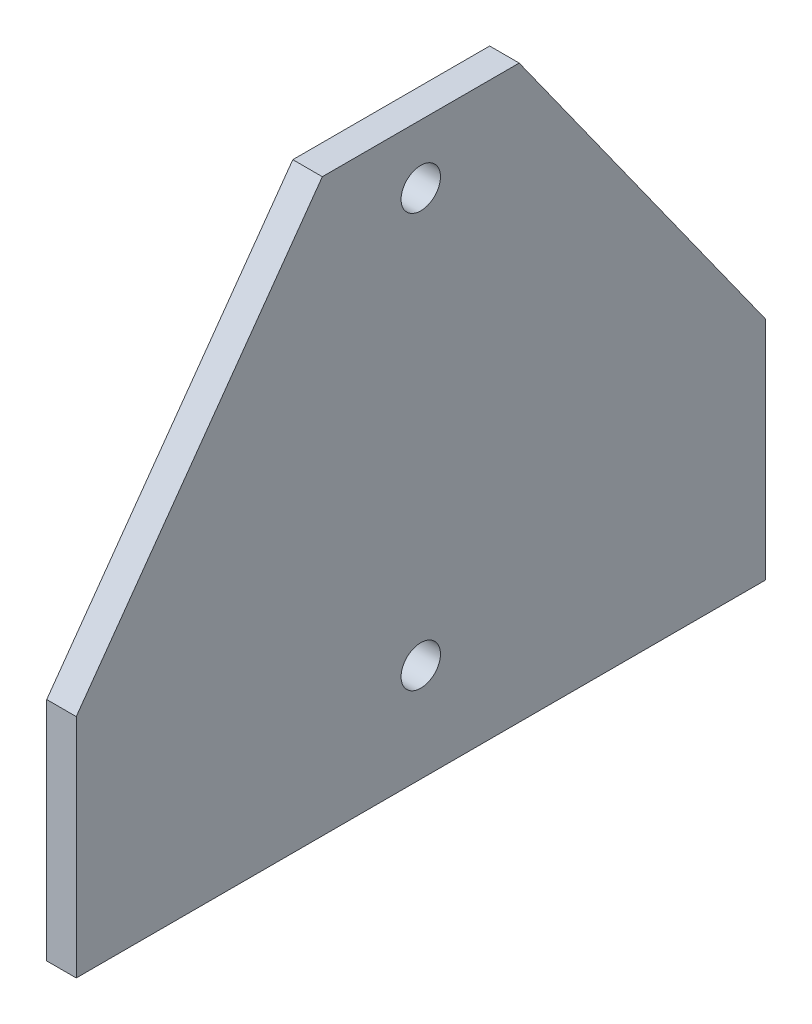
ISO-10303-21;
HEADER;
FILE_DESCRIPTION(('STEP AP214'),'2;1');
FILE_NAME('part.step','',(''),(''),'','','');
FILE_SCHEMA(('AUTOMOTIVE_DESIGN { 1 0 10303 214 1 1 1 1 }'));
ENDSEC;
DATA;
#1=APPLICATION_CONTEXT('core data for automotive mechanical design processes');
#2=APPLICATION_PROTOCOL_DEFINITION('international standard','automotive_design',2000,#1);
#3=PRODUCT_CONTEXT('',#1,'mechanical');
#4=PRODUCT('Part','Part','',(#3));
#5=PRODUCT_RELATED_PRODUCT_CATEGORY('part','',(#4));
#6=PRODUCT_DEFINITION_FORMATION('','',#4);
#7=PRODUCT_DEFINITION_CONTEXT('part definition',#1,'design');
#8=PRODUCT_DEFINITION('design','',#6,#7);
#9=PRODUCT_DEFINITION_SHAPE('','',#8);
#10=(LENGTH_UNIT() NAMED_UNIT(*) SI_UNIT(.MILLI.,.METRE.));
#11=(NAMED_UNIT(*) PLANE_ANGLE_UNIT() SI_UNIT($,.RADIAN.));
#12=(NAMED_UNIT(*) SI_UNIT($,.STERADIAN.) SOLID_ANGLE_UNIT());
#13=UNCERTAINTY_MEASURE_WITH_UNIT(LENGTH_MEASURE(1.E-05),#10,'distance_accuracy_value','');
#14=(GEOMETRIC_REPRESENTATION_CONTEXT(3) GLOBAL_UNCERTAINTY_ASSIGNED_CONTEXT((#13)) GLOBAL_UNIT_ASSIGNED_CONTEXT((#10,
#11,#12)) REPRESENTATION_CONTEXT('',''));
#15=CARTESIAN_POINT('',(0.,0.,0.));
#16=DIRECTION('',(0.,0.,1.));
#17=DIRECTION('',(1.,0.,0.));
#18=AXIS2_PLACEMENT_3D('',#15,#16,#17);
#19=CARTESIAN_POINT('',(3.,0.,0.));
#20=DIRECTION('',(1.,0.,0.));
#21=DIRECTION('',(0.,0.,-1.));
#22=AXIS2_PLACEMENT_3D('',#19,#20,#21);
#23=PLANE('',#22);
#24=CARTESIAN_POINT('',(3.,-13.,-35.));
#25=DIRECTION('',(1.,0.,0.));
#26=DIRECTION('',(0.,0.,-1.));
#27=AXIS2_PLACEMENT_3D('',#24,#25,#26);
#28=CIRCLE('',#27,2.);
#29=CARTESIAN_POINT('',(3.,-13.,-37.));
#30=VERTEX_POINT('',#29);
#31=EDGE_CURVE('E121',#30,#30,#28,.T.);
#32=ORIENTED_EDGE('',*,*,#31,.F.);
#33=EDGE_LOOP('',(#32));
#34=FACE_BOUND('',#33,.T.);
#35=DIRECTION('',(0.,-1.,0.));
#36=VECTOR('',#35,1.);
#37=CARTESIAN_POINT('',(3.,0.,0.));
#38=LINE('',#37,#36);
#39=CARTESIAN_POINT('',(3.,0.,0.));
#40=VERTEX_POINT('',#39);
#41=CARTESIAN_POINT('',(3.,-23.,0.));
#42=VERTEX_POINT('',#41);
#43=EDGE_CURVE('E128',#40,#42,#38,.T.);
#44=ORIENTED_EDGE('',*,*,#43,.T.);
#45=DIRECTION('',(0.,0.,-1.));
#46=VECTOR('',#45,1.);
#47=CARTESIAN_POINT('',(3.,-23.,0.));
#48=LINE('',#47,#46);
#49=CARTESIAN_POINT('',(3.,-23.,-70.));
#50=VERTEX_POINT('',#49);
#51=EDGE_CURVE('E86',#42,#50,#48,.T.);
#52=ORIENTED_EDGE('',*,*,#51,.T.);
#53=DIRECTION('',(0.,1.,0.));
#54=VECTOR('',#53,1.);
#55=CARTESIAN_POINT('',(3.,0.,-70.));
#56=LINE('',#55,#54);
#57=CARTESIAN_POINT('',(3.,0.,-70.));
#58=VERTEX_POINT('',#57);
#59=EDGE_CURVE('E99',#50,#58,#56,.T.);
#60=ORIENTED_EDGE('',*,*,#59,.T.);
#61=DIRECTION('',(0.,0.813733471206735,0.581238193719096));
#62=VECTOR('',#61,1.);
#63=CARTESIAN_POINT('',(3.,35.,-45.));
#64=LINE('',#63,#62);
#65=CARTESIAN_POINT('',(3.,35.,-45.));
#66=VERTEX_POINT('',#65);
#67=EDGE_CURVE('E93',#58,#66,#64,.T.);
#68=ORIENTED_EDGE('',*,*,#67,.T.);
#69=DIRECTION('',(0.,0.,1.));
#70=VECTOR('',#69,1.);
#71=CARTESIAN_POINT('',(3.,35.,-25.));
#72=LINE('',#71,#70);
#73=CARTESIAN_POINT('',(3.,35.,-25.));
#74=VERTEX_POINT('',#73);
#75=EDGE_CURVE('E97',#66,#74,#72,.T.);
#76=ORIENTED_EDGE('',*,*,#75,.T.);
#77=DIRECTION('',(0.,-0.813733471206735,0.581238193719096));
#78=VECTOR('',#77,1.);
#79=CARTESIAN_POINT('',(3.,0.,0.));
#80=LINE('',#79,#78);
#81=EDGE_CURVE('E49',#74,#40,#80,.T.);
#82=ORIENTED_EDGE('',*,*,#81,.T.);
#83=EDGE_LOOP('',(#44,#52,#60,#68,#76,#82));
#84=FACE_BOUND('',#83,.T.);
#85=CARTESIAN_POINT('',(3.,29.,-35.));
#86=DIRECTION('',(1.,0.,0.));
#87=DIRECTION('',(0.,0.,-1.));
#88=AXIS2_PLACEMENT_3D('',#85,#86,#87);
#89=CIRCLE('',#88,2.);
#90=CARTESIAN_POINT('',(3.,29.,-37.));
#91=VERTEX_POINT('',#90);
#92=EDGE_CURVE('E171',#91,#91,#89,.T.);
#93=ORIENTED_EDGE('',*,*,#92,.F.);
#94=EDGE_LOOP('',(#93));
#95=FACE_BOUND('',#94,.T.);
#96=ADVANCED_FACE('F32',(#34,#84,#95),#23,.T.);
#97=CARTESIAN_POINT('',(0.,0.,0.));
#98=DIRECTION('',(1.,0.,0.));
#99=DIRECTION('',(0.,0.,-1.));
#100=AXIS2_PLACEMENT_3D('',#97,#98,#99);
#101=PLANE('',#100);
#102=CARTESIAN_POINT('',(0.,-13.,-35.));
#103=DIRECTION('',(1.,0.,0.));
#104=DIRECTION('',(0.,0.,-1.));
#105=AXIS2_PLACEMENT_3D('',#102,#103,#104);
#106=CIRCLE('',#105,2.);
#107=CARTESIAN_POINT('',(0.,-13.,-37.));
#108=VERTEX_POINT('',#107);
#109=EDGE_CURVE('E176',#108,#108,#106,.T.);
#110=ORIENTED_EDGE('',*,*,#109,.T.);
#111=EDGE_LOOP('',(#110));
#112=FACE_BOUND('',#111,.T.);
#113=DIRECTION('',(0.,-1.,0.));
#114=VECTOR('',#113,1.);
#115=CARTESIAN_POINT('',(0.,0.,0.));
#116=LINE('',#115,#114);
#117=CARTESIAN_POINT('',(0.,0.,0.));
#118=VERTEX_POINT('',#117);
#119=CARTESIAN_POINT('',(0.,-23.,0.));
#120=VERTEX_POINT('',#119);
#121=EDGE_CURVE('E117',#118,#120,#116,.T.);
#122=ORIENTED_EDGE('',*,*,#121,.F.);
#123=DIRECTION('',(0.,-0.813733471206735,0.581238193719096));
#124=VECTOR('',#123,1.);
#125=CARTESIAN_POINT('',(0.,0.,0.));
#126=LINE('',#125,#124);
#127=CARTESIAN_POINT('',(0.,35.,-25.));
#128=VERTEX_POINT('',#127);
#129=EDGE_CURVE('E78',#128,#118,#126,.T.);
#130=ORIENTED_EDGE('',*,*,#129,.F.);
#131=DIRECTION('',(0.,0.,1.));
#132=VECTOR('',#131,1.);
#133=CARTESIAN_POINT('',(0.,35.,-25.));
#134=LINE('',#133,#132);
#135=CARTESIAN_POINT('',(0.,35.,-45.));
#136=VERTEX_POINT('',#135);
#137=EDGE_CURVE('E72',#136,#128,#134,.T.);
#138=ORIENTED_EDGE('',*,*,#137,.F.);
#139=DIRECTION('',(0.,0.813733471206735,0.581238193719096));
#140=VECTOR('',#139,1.);
#141=CARTESIAN_POINT('',(0.,35.,-45.));
#142=LINE('',#141,#140);
#143=CARTESIAN_POINT('',(0.,0.,-70.));
#144=VERTEX_POINT('',#143);
#145=EDGE_CURVE('E107',#144,#136,#142,.T.);
#146=ORIENTED_EDGE('',*,*,#145,.F.);
#147=DIRECTION('',(0.,1.,0.));
#148=VECTOR('',#147,1.);
#149=CARTESIAN_POINT('',(0.,0.,-70.));
#150=LINE('',#149,#148);
#151=CARTESIAN_POINT('',(0.,-23.,-70.));
#152=VERTEX_POINT('',#151);
#153=EDGE_CURVE('E123',#152,#144,#150,.T.);
#154=ORIENTED_EDGE('',*,*,#153,.F.);
#155=DIRECTION('',(0.,0.,-1.));
#156=VECTOR('',#155,1.);
#157=CARTESIAN_POINT('',(0.,-23.,0.));
#158=LINE('',#157,#156);
#159=EDGE_CURVE('E120',#120,#152,#158,.T.);
#160=ORIENTED_EDGE('',*,*,#159,.F.);
#161=EDGE_LOOP('',(#122,#130,#138,#146,#154,#160));
#162=FACE_BOUND('',#161,.T.);
#163=CARTESIAN_POINT('',(0.,29.,-35.));
#164=DIRECTION('',(1.,0.,0.));
#165=DIRECTION('',(0.,0.,-1.));
#166=AXIS2_PLACEMENT_3D('',#163,#164,#165);
#167=CIRCLE('',#166,2.);
#168=CARTESIAN_POINT('',(0.,29.,-37.));
#169=VERTEX_POINT('',#168);
#170=EDGE_CURVE('E174',#169,#169,#167,.T.);
#171=ORIENTED_EDGE('',*,*,#170,.T.);
#172=EDGE_LOOP('',(#171));
#173=FACE_BOUND('',#172,.T.);
#174=ADVANCED_FACE('F137',(#112,#162,#173),#101,.F.);
#175=CARTESIAN_POINT('',(3.,0.,0.));
#176=DIRECTION('',(0.,0.,-1.));
#177=DIRECTION('',(0.,1.,0.));
#178=AXIS2_PLACEMENT_3D('',#175,#176,#177);
#179=PLANE('',#178);
#180=ORIENTED_EDGE('',*,*,#121,.T.);
#181=DIRECTION('',(-1.,0.,0.));
#182=VECTOR('',#181,1.);
#183=CARTESIAN_POINT('',(3.,-23.,0.));
#184=LINE('',#183,#182);
#185=EDGE_CURVE('E11',#42,#120,#184,.T.);
#186=ORIENTED_EDGE('',*,*,#185,.F.);
#187=ORIENTED_EDGE('',*,*,#43,.F.);
#188=DIRECTION('',(-1.,0.,0.));
#189=VECTOR('',#188,1.);
#190=CARTESIAN_POINT('',(3.,0.,0.));
#191=LINE('',#190,#189);
#192=EDGE_CURVE('E113',#40,#118,#191,.T.);
#193=ORIENTED_EDGE('',*,*,#192,.T.);
#194=EDGE_LOOP('',(#180,#186,#187,#193));
#195=FACE_BOUND('',#194,.T.);
#196=ADVANCED_FACE('F34',(#195),#179,.F.);
#197=CARTESIAN_POINT('',(3.,-23.,0.));
#198=DIRECTION('',(0.,1.,0.));
#199=DIRECTION('',(0.,0.,1.));
#200=AXIS2_PLACEMENT_3D('',#197,#198,#199);
#201=PLANE('',#200);
#202=ORIENTED_EDGE('',*,*,#159,.T.);
#203=DIRECTION('',(-1.,0.,0.));
#204=VECTOR('',#203,1.);
#205=CARTESIAN_POINT('',(3.,-23.,-70.));
#206=LINE('',#205,#204);
#207=EDGE_CURVE('E41',#50,#152,#206,.T.);
#208=ORIENTED_EDGE('',*,*,#207,.F.);
#209=ORIENTED_EDGE('',*,*,#51,.F.);
#210=ORIENTED_EDGE('',*,*,#185,.T.);
#211=EDGE_LOOP('',(#202,#208,#209,#210));
#212=FACE_BOUND('',#211,.T.);
#213=ADVANCED_FACE('F217',(#212),#201,.F.);
#214=CARTESIAN_POINT('',(3.,0.,-70.));
#215=DIRECTION('',(0.,0.,1.));
#216=DIRECTION('',(0.,-1.,0.));
#217=AXIS2_PLACEMENT_3D('',#214,#215,#216);
#218=PLANE('',#217);
#219=ORIENTED_EDGE('',*,*,#153,.T.);
#220=DIRECTION('',(-1.,0.,0.));
#221=VECTOR('',#220,1.);
#222=CARTESIAN_POINT('',(3.,0.,-70.));
#223=LINE('',#222,#221);
#224=EDGE_CURVE('E108',#58,#144,#223,.T.);
#225=ORIENTED_EDGE('',*,*,#224,.F.);
#226=ORIENTED_EDGE('',*,*,#59,.F.);
#227=ORIENTED_EDGE('',*,*,#207,.T.);
#228=EDGE_LOOP('',(#219,#225,#226,#227));
#229=FACE_BOUND('',#228,.T.);
#230=ADVANCED_FACE('F134',(#229),#218,.F.);
#231=CARTESIAN_POINT('',(3.,35.,-45.));
#232=DIRECTION('',(0.,-0.581238193719096,0.813733471206735));
#233=DIRECTION('',(0.,-0.813733471206735,-0.581238193719096));
#234=AXIS2_PLACEMENT_3D('',#231,#232,#233);
#235=PLANE('',#234);
#236=ORIENTED_EDGE('',*,*,#145,.T.);
#237=DIRECTION('',(-1.,0.,0.));
#238=VECTOR('',#237,1.);
#239=CARTESIAN_POINT('',(3.,35.,-45.));
#240=LINE('',#239,#238);
#241=EDGE_CURVE('E104',#66,#136,#240,.T.);
#242=ORIENTED_EDGE('',*,*,#241,.F.);
#243=ORIENTED_EDGE('',*,*,#67,.F.);
#244=ORIENTED_EDGE('',*,*,#224,.T.);
#245=EDGE_LOOP('',(#236,#242,#243,#244));
#246=FACE_BOUND('',#245,.T.);
#247=ADVANCED_FACE('F105',(#246),#235,.F.);
#248=CARTESIAN_POINT('',(3.,35.,-25.));
#249=DIRECTION('',(0.,-1.,0.));
#250=DIRECTION('',(0.,0.,-1.));
#251=AXIS2_PLACEMENT_3D('',#248,#249,#250);
#252=PLANE('',#251);
#253=ORIENTED_EDGE('',*,*,#137,.T.);
#254=DIRECTION('',(-1.,0.,0.));
#255=VECTOR('',#254,1.);
#256=CARTESIAN_POINT('',(3.,35.,-25.));
#257=LINE('',#256,#255);
#258=EDGE_CURVE('E109',#74,#128,#257,.T.);
#259=ORIENTED_EDGE('',*,*,#258,.F.);
#260=ORIENTED_EDGE('',*,*,#75,.F.);
#261=ORIENTED_EDGE('',*,*,#241,.T.);
#262=EDGE_LOOP('',(#253,#259,#260,#261));
#263=FACE_BOUND('',#262,.T.);
#264=ADVANCED_FACE('F111',(#263),#252,.F.);
#265=CARTESIAN_POINT('',(3.,0.,0.));
#266=DIRECTION('',(0.,-0.581238193719096,-0.813733471206735));
#267=DIRECTION('',(0.,0.813733471206735,-0.581238193719096));
#268=AXIS2_PLACEMENT_3D('',#265,#266,#267);
#269=PLANE('',#268);
#270=ORIENTED_EDGE('',*,*,#129,.T.);
#271=ORIENTED_EDGE('',*,*,#192,.F.);
#272=ORIENTED_EDGE('',*,*,#81,.F.);
#273=ORIENTED_EDGE('',*,*,#258,.T.);
#274=EDGE_LOOP('',(#270,#271,#272,#273));
#275=FACE_BOUND('',#274,.T.);
#276=ADVANCED_FACE('F142',(#275),#269,.F.);
#277=CARTESIAN_POINT('',(3.,-13.,-35.));
#278=DIRECTION('',(-1.,0.,0.));
#279=DIRECTION('',(0.,0.,1.));
#280=AXIS2_PLACEMENT_3D('',#277,#278,#279);
#281=CYLINDRICAL_SURFACE('',#280,2.);
#282=ORIENTED_EDGE('',*,*,#31,.T.);
#283=EDGE_LOOP('',(#282));
#284=FACE_BOUND('',#283,.T.);
#285=ORIENTED_EDGE('',*,*,#109,.F.);
#286=EDGE_LOOP('',(#285));
#287=FACE_BOUND('',#286,.T.);
#288=ADVANCED_FACE('F144',(#284,#287),#281,.F.);
#289=CARTESIAN_POINT('',(3.,29.,-35.));
#290=DIRECTION('',(-1.,0.,0.));
#291=DIRECTION('',(0.,0.,1.));
#292=AXIS2_PLACEMENT_3D('',#289,#290,#291);
#293=CYLINDRICAL_SURFACE('',#292,2.);
#294=ORIENTED_EDGE('',*,*,#92,.T.);
#295=EDGE_LOOP('',(#294));
#296=FACE_BOUND('',#295,.T.);
#297=ORIENTED_EDGE('',*,*,#170,.F.);
#298=EDGE_LOOP('',(#297));
#299=FACE_BOUND('',#298,.T.);
#300=ADVANCED_FACE('F150',(#296,#299),#293,.F.);
#301=CLOSED_SHELL('',(#96,#174,#196,#213,#230,#247,#264,#276,#288,#300));
#302=MANIFOLD_SOLID_BREP('B2',#301);
#303=ADVANCED_BREP_SHAPE_REPRESENTATION('',(#18,#302),#14);
#304=SHAPE_DEFINITION_REPRESENTATION(#9,#303);
ENDSEC;
END-ISO-10303-21;
